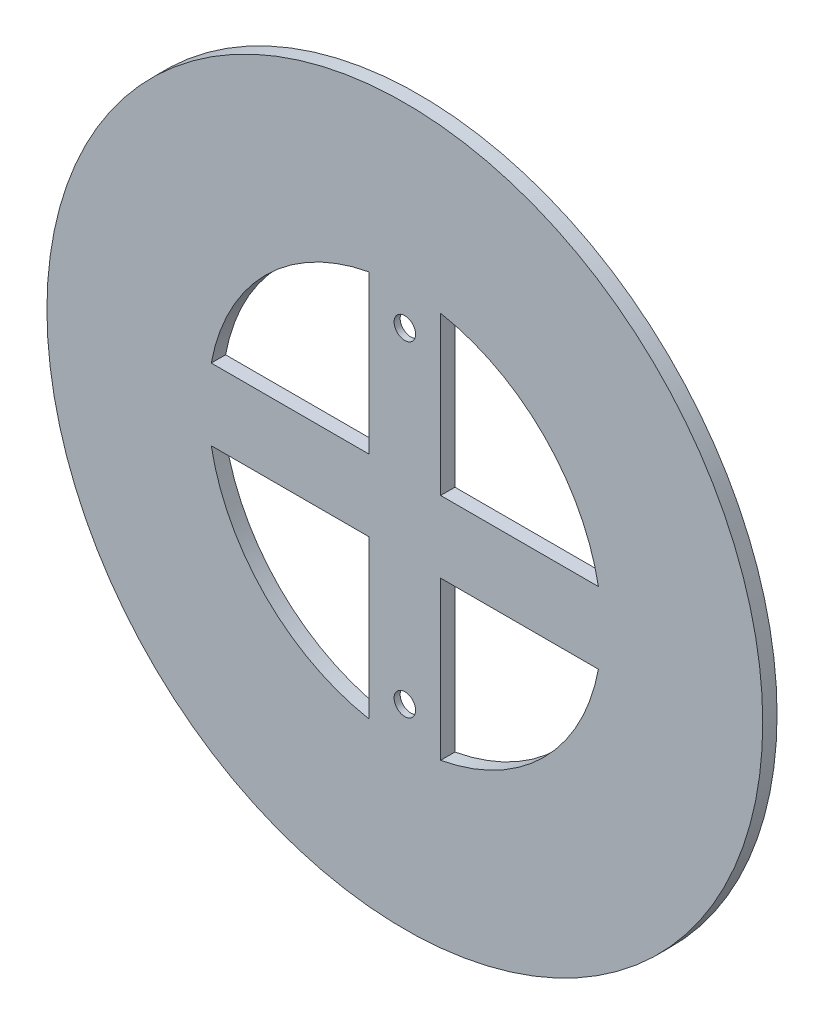
ISO-10303-21;
HEADER;
FILE_DESCRIPTION(('STEP AP214'),'2;1');
FILE_NAME('part.step','',(''),(''),'','','');
FILE_SCHEMA(('AUTOMOTIVE_DESIGN { 1 0 10303 214 1 1 1 1 }'));
ENDSEC;
DATA;
#1=APPLICATION_CONTEXT('core data for automotive mechanical design processes');
#2=APPLICATION_PROTOCOL_DEFINITION('international standard','automotive_design',2000,#1);
#3=PRODUCT_CONTEXT('',#1,'mechanical');
#4=PRODUCT('Part','Part','',(#3));
#5=PRODUCT_RELATED_PRODUCT_CATEGORY('part','',(#4));
#6=PRODUCT_DEFINITION_FORMATION('','',#4);
#7=PRODUCT_DEFINITION_CONTEXT('part definition',#1,'design');
#8=PRODUCT_DEFINITION('design','',#6,#7);
#9=PRODUCT_DEFINITION_SHAPE('','',#8);
#10=(LENGTH_UNIT() NAMED_UNIT(*) SI_UNIT(.MILLI.,.METRE.));
#11=(NAMED_UNIT(*) PLANE_ANGLE_UNIT() SI_UNIT($,.RADIAN.));
#12=(NAMED_UNIT(*) SI_UNIT($,.STERADIAN.) SOLID_ANGLE_UNIT());
#13=UNCERTAINTY_MEASURE_WITH_UNIT(LENGTH_MEASURE(1.E-05),#10,'distance_accuracy_value','');
#14=(GEOMETRIC_REPRESENTATION_CONTEXT(3) GLOBAL_UNCERTAINTY_ASSIGNED_CONTEXT((#13)) GLOBAL_UNIT_ASSIGNED_CONTEXT((#10,
#11,#12)) REPRESENTATION_CONTEXT('',''));
#15=CARTESIAN_POINT('',(0.,0.,0.));
#16=DIRECTION('',(0.,0.,1.));
#17=DIRECTION('',(1.,0.,0.));
#18=AXIS2_PLACEMENT_3D('',#15,#16,#17);
#19=CARTESIAN_POINT('',(0.,0.,0.));
#20=DIRECTION('',(0.,0.,1.));
#21=DIRECTION('',(1.,0.,0.));
#22=AXIS2_PLACEMENT_3D('',#19,#20,#21);
#23=PLANE('',#22);
#24=CARTESIAN_POINT('',(0.,0.,0.));
#25=DIRECTION('',(0.,0.,1.));
#26=DIRECTION('',(1.,0.,0.));
#27=AXIS2_PLACEMENT_3D('',#24,#25,#26);
#28=CIRCLE('',#27,50.);
#29=CARTESIAN_POINT('',(50.,0.,0.));
#30=VERTEX_POINT('',#29);
#31=EDGE_CURVE('E237',#30,#30,#28,.T.);
#32=ORIENTED_EDGE('',*,*,#31,.F.);
#33=EDGE_LOOP('',(#32));
#34=FACE_BOUND('',#33,.T.);
#35=CARTESIAN_POINT('',(0.,0.,0.));
#36=DIRECTION('',(0.,0.,1.));
#37=DIRECTION('',(1.,0.,0.));
#38=AXIS2_PLACEMENT_3D('',#35,#36,#37);
#39=CIRCLE('',#38,42.5);
#40=CARTESIAN_POINT('',(42.5,0.,0.));
#41=VERTEX_POINT('',#40);
#42=EDGE_CURVE('E231',#41,#41,#39,.T.);
#43=ORIENTED_EDGE('',*,*,#42,.T.);
#44=EDGE_LOOP('',(#43));
#45=FACE_BOUND('',#44,.T.);
#46=ADVANCED_FACE('F33',(#34,#45),#23,.F.);
#47=CARTESIAN_POINT('',(0.,0.,2.));
#48=DIRECTION('',(0.,0.,-1.));
#49=DIRECTION('',(-1.,0.,0.));
#50=AXIS2_PLACEMENT_3D('',#47,#48,#49);
#51=CYLINDRICAL_SURFACE('',#50,50.);
#52=CARTESIAN_POINT('',(0.,0.,2.));
#53=DIRECTION('',(0.,0.,1.));
#54=DIRECTION('',(1.,0.,0.));
#55=AXIS2_PLACEMENT_3D('',#52,#53,#54);
#56=CIRCLE('',#55,50.);
#57=CARTESIAN_POINT('',(50.,0.,2.));
#58=VERTEX_POINT('',#57);
#59=EDGE_CURVE('E240',#58,#58,#56,.T.);
#60=ORIENTED_EDGE('',*,*,#59,.F.);
#61=EDGE_LOOP('',(#60));
#62=FACE_BOUND('',#61,.T.);
#63=ORIENTED_EDGE('',*,*,#31,.T.);
#64=EDGE_LOOP('',(#63));
#65=FACE_BOUND('',#64,.T.);
#66=ADVANCED_FACE('F272',(#62,#65),#51,.T.);
#67=CARTESIAN_POINT('',(0.,0.,2.));
#68=DIRECTION('',(0.,0.,1.));
#69=DIRECTION('',(1.,0.,0.));
#70=AXIS2_PLACEMENT_3D('',#67,#68,#69);
#71=PLANE('',#70);
#72=CARTESIAN_POINT('',(0.,0.,2.));
#73=DIRECTION('',(0.,0.,-1.));
#74=DIRECTION('',(-1.,0.,0.));
#75=AXIS2_PLACEMENT_3D('',#72,#73,#74);
#76=CIRCLE('',#75,27.5);
#77=CARTESIAN_POINT('',(27.0416345659799,-5.00000000000001,2.));
#78=VERTEX_POINT('',#77);
#79=CARTESIAN_POINT('',(4.99999999999999,-27.0416345659799,2.));
#80=VERTEX_POINT('',#79);
#81=EDGE_CURVE('E124',#78,#80,#76,.T.);
#82=ORIENTED_EDGE('',*,*,#81,.T.);
#83=DIRECTION('',(0.,1.,0.));
#84=VECTOR('',#83,1.);
#85=CARTESIAN_POINT('',(4.99999999999999,-27.0416345659799,2.));
#86=LINE('',#85,#84);
#87=CARTESIAN_POINT('',(4.99999999999999,-5.00000000000001,2.));
#88=VERTEX_POINT('',#87);
#89=EDGE_CURVE('E131',#80,#88,#86,.T.);
#90=ORIENTED_EDGE('',*,*,#89,.T.);
#91=DIRECTION('',(1.,0.,0.));
#92=VECTOR('',#91,1.);
#93=CARTESIAN_POINT('',(27.0416345659799,-5.00000000000001,2.));
#94=LINE('',#93,#92);
#95=EDGE_CURVE('E48',#88,#78,#94,.T.);
#96=ORIENTED_EDGE('',*,*,#95,.T.);
#97=EDGE_LOOP('',(#82,#90,#96));
#98=FACE_BOUND('',#97,.T.);
#99=CARTESIAN_POINT('',(0.,0.,2.));
#100=DIRECTION('',(0.,0.,-1.));
#101=DIRECTION('',(-1.,0.,0.));
#102=AXIS2_PLACEMENT_3D('',#99,#100,#101);
#103=CIRCLE('',#102,27.5);
#104=CARTESIAN_POINT('',(-5.00000000000001,-27.0416345659799,2.));
#105=VERTEX_POINT('',#104);
#106=CARTESIAN_POINT('',(-27.0416345659799,-5.,2.));
#107=VERTEX_POINT('',#106);
#108=EDGE_CURVE('E150',#105,#107,#103,.T.);
#109=ORIENTED_EDGE('',*,*,#108,.T.);
#110=DIRECTION('',(1.,0.,0.));
#111=VECTOR('',#110,1.);
#112=CARTESIAN_POINT('',(-27.0416345659799,-5.,2.));
#113=LINE('',#112,#111);
#114=CARTESIAN_POINT('',(-5.00000000000001,-5.,2.));
#115=VERTEX_POINT('',#114);
#116=EDGE_CURVE('E153',#107,#115,#113,.T.);
#117=ORIENTED_EDGE('',*,*,#116,.T.);
#118=DIRECTION('',(0.,-1.,0.));
#119=VECTOR('',#118,1.);
#120=CARTESIAN_POINT('',(-5.00000000000001,-27.0416345659799,2.));
#121=LINE('',#120,#119);
#122=EDGE_CURVE('E157',#115,#105,#121,.T.);
#123=ORIENTED_EDGE('',*,*,#122,.T.);
#124=EDGE_LOOP('',(#109,#117,#123));
#125=FACE_BOUND('',#124,.T.);
#126=CARTESIAN_POINT('',(0.,-22.75,2.));
#127=DIRECTION('',(0.,0.,-1.));
#128=DIRECTION('',(1.,0.,0.));
#129=AXIS2_PLACEMENT_3D('',#126,#127,#128);
#130=CIRCLE('',#129,1.5);
#131=CARTESIAN_POINT('',(1.5,-22.75,2.));
#132=VERTEX_POINT('',#131);
#133=EDGE_CURVE('E169',#132,#132,#130,.T.);
#134=ORIENTED_EDGE('',*,*,#133,.T.);
#135=EDGE_LOOP('',(#134));
#136=FACE_BOUND('',#135,.T.);
#137=CARTESIAN_POINT('',(0.,0.,2.));
#138=DIRECTION('',(0.,0.,-1.));
#139=DIRECTION('',(-1.,0.,0.));
#140=AXIS2_PLACEMENT_3D('',#137,#138,#139);
#141=CIRCLE('',#140,27.5);
#142=CARTESIAN_POINT('',(-27.0416345659799,5.,2.));
#143=VERTEX_POINT('',#142);
#144=CARTESIAN_POINT('',(-5.,27.0416345659799,2.));
#145=VERTEX_POINT('',#144);
#146=EDGE_CURVE('E177',#143,#145,#141,.T.);
#147=ORIENTED_EDGE('',*,*,#146,.T.);
#148=DIRECTION('',(0.,-1.,0.));
#149=VECTOR('',#148,1.);
#150=CARTESIAN_POINT('',(-5.,27.0416345659799,2.));
#151=LINE('',#150,#149);
#152=CARTESIAN_POINT('',(-5.,5.,2.));
#153=VERTEX_POINT('',#152);
#154=EDGE_CURVE('E180',#145,#153,#151,.T.);
#155=ORIENTED_EDGE('',*,*,#154,.T.);
#156=DIRECTION('',(-1.,0.,0.));
#157=VECTOR('',#156,1.);
#158=CARTESIAN_POINT('',(-27.0416345659799,5.,2.));
#159=LINE('',#158,#157);
#160=EDGE_CURVE('E184',#153,#143,#159,.T.);
#161=ORIENTED_EDGE('',*,*,#160,.T.);
#162=EDGE_LOOP('',(#147,#155,#161));
#163=FACE_BOUND('',#162,.T.);
#164=CARTESIAN_POINT('',(0.,22.75,2.));
#165=DIRECTION('',(0.,0.,-1.));
#166=DIRECTION('',(-1.,0.,0.));
#167=AXIS2_PLACEMENT_3D('',#164,#165,#166);
#168=CIRCLE('',#167,1.5);
#169=CARTESIAN_POINT('',(-1.5,22.75,2.));
#170=VERTEX_POINT('',#169);
#171=EDGE_CURVE('E196',#170,#170,#168,.T.);
#172=ORIENTED_EDGE('',*,*,#171,.T.);
#173=EDGE_LOOP('',(#172));
#174=FACE_BOUND('',#173,.T.);
#175=CARTESIAN_POINT('',(0.,0.,2.));
#176=DIRECTION('',(0.,0.,-1.));
#177=DIRECTION('',(-1.,0.,0.));
#178=AXIS2_PLACEMENT_3D('',#175,#176,#177);
#179=CIRCLE('',#178,27.5);
#180=CARTESIAN_POINT('',(5.,27.0416345659799,2.));
#181=VERTEX_POINT('',#180);
#182=CARTESIAN_POINT('',(27.0416345659799,4.99999999999999,2.));
#183=VERTEX_POINT('',#182);
#184=EDGE_CURVE('E204',#181,#183,#179,.T.);
#185=ORIENTED_EDGE('',*,*,#184,.T.);
#186=DIRECTION('',(-1.,0.,0.));
#187=VECTOR('',#186,1.);
#188=CARTESIAN_POINT('',(27.0416345659799,4.99999999999999,2.));
#189=LINE('',#188,#187);
#190=CARTESIAN_POINT('',(5.,4.99999999999999,2.));
#191=VERTEX_POINT('',#190);
#192=EDGE_CURVE('E207',#183,#191,#189,.T.);
#193=ORIENTED_EDGE('',*,*,#192,.T.);
#194=DIRECTION('',(0.,1.,0.));
#195=VECTOR('',#194,1.);
#196=CARTESIAN_POINT('',(5.,27.0416345659799,2.));
#197=LINE('',#196,#195);
#198=EDGE_CURVE('E211',#191,#181,#197,.T.);
#199=ORIENTED_EDGE('',*,*,#198,.T.);
#200=EDGE_LOOP('',(#185,#193,#199));
#201=FACE_BOUND('',#200,.T.);
#202=ORIENTED_EDGE('',*,*,#59,.T.);
#203=EDGE_LOOP('',(#202));
#204=FACE_BOUND('',#203,.T.);
#205=ADVANCED_FACE('F135',(#98,#125,#136,#163,#174,#201,#204),#71,.T.);
#206=CARTESIAN_POINT('',(0.,0.,1.));
#207=DIRECTION('',(0.,0.,1.));
#208=DIRECTION('',(1.,0.,0.));
#209=AXIS2_PLACEMENT_3D('',#206,#207,#208);
#210=PLANE('',#209);
#211=CARTESIAN_POINT('',(0.,0.,1.));
#212=DIRECTION('',(0.,0.,1.));
#213=DIRECTION('',(1.,0.,0.));
#214=AXIS2_PLACEMENT_3D('',#211,#212,#213);
#215=CIRCLE('',#214,42.5);
#216=CARTESIAN_POINT('',(42.5,0.,1.));
#217=VERTEX_POINT('',#216);
#218=EDGE_CURVE('E234',#217,#217,#215,.T.);
#219=ORIENTED_EDGE('',*,*,#218,.F.);
#220=EDGE_LOOP('',(#219));
#221=FACE_BOUND('',#220,.T.);
#222=CARTESIAN_POINT('',(0.,0.,1.));
#223=DIRECTION('',(0.,0.,1.));
#224=DIRECTION('',(1.,0.,0.));
#225=AXIS2_PLACEMENT_3D('',#222,#223,#224);
#226=CIRCLE('',#225,36.25);
#227=CARTESIAN_POINT('',(36.25,0.,1.));
#228=VERTEX_POINT('',#227);
#229=EDGE_CURVE('E228',#228,#228,#226,.T.);
#230=ORIENTED_EDGE('',*,*,#229,.T.);
#231=EDGE_LOOP('',(#230));
#232=FACE_BOUND('',#231,.T.);
#233=ADVANCED_FACE('F271',(#221,#232),#210,.F.);
#234=CARTESIAN_POINT('',(0.,0.,1.));
#235=DIRECTION('',(0.,0.,-1.));
#236=DIRECTION('',(-1.,0.,0.));
#237=AXIS2_PLACEMENT_3D('',#234,#235,#236);
#238=CYLINDRICAL_SURFACE('',#237,42.5);
#239=ORIENTED_EDGE('',*,*,#218,.T.);
#240=EDGE_LOOP('',(#239));
#241=FACE_BOUND('',#240,.T.);
#242=ORIENTED_EDGE('',*,*,#42,.F.);
#243=EDGE_LOOP('',(#242));
#244=FACE_BOUND('',#243,.T.);
#245=ADVANCED_FACE('F292',(#241,#244),#238,.F.);
#246=CARTESIAN_POINT('',(0.,0.,1.));
#247=DIRECTION('',(0.,0.,-1.));
#248=DIRECTION('',(-1.,0.,0.));
#249=AXIS2_PLACEMENT_3D('',#246,#247,#248);
#250=CYLINDRICAL_SURFACE('',#249,36.25);
#251=ORIENTED_EDGE('',*,*,#229,.F.);
#252=EDGE_LOOP('',(#251));
#253=FACE_BOUND('',#252,.T.);
#254=CARTESIAN_POINT('',(0.,0.,0.));
#255=DIRECTION('',(0.,0.,1.));
#256=DIRECTION('',(1.,0.,0.));
#257=AXIS2_PLACEMENT_3D('',#254,#255,#256);
#258=CIRCLE('',#257,36.25);
#259=CARTESIAN_POINT('',(36.25,0.,0.));
#260=VERTEX_POINT('',#259);
#261=EDGE_CURVE('E223',#260,#260,#258,.T.);
#262=ORIENTED_EDGE('',*,*,#261,.T.);
#263=EDGE_LOOP('',(#262));
#264=FACE_BOUND('',#263,.T.);
#265=ADVANCED_FACE('F294',(#253,#264),#250,.T.);
#266=CARTESIAN_POINT('',(0.,-22.75,0.));
#267=DIRECTION('',(0.,0.,1.));
#268=DIRECTION('',(1.,0.,0.));
#269=AXIS2_PLACEMENT_3D('',#266,#267,#268);
#270=CIRCLE('',#269,3.50000000000003);
#271=CARTESIAN_POINT('',(3.50000000000003,-22.75,0.));
#272=VERTEX_POINT('',#271);
#273=EDGE_CURVE('E41',#272,#272,#270,.T.);
#274=ORIENTED_EDGE('',*,*,#273,.T.);
#275=EDGE_LOOP('',(#274));
#276=FACE_BOUND('',#275,.T.);
#277=CARTESIAN_POINT('',(0.,22.75,0.));
#278=DIRECTION('',(0.,0.,1.));
#279=DIRECTION('',(1.,0.,0.));
#280=AXIS2_PLACEMENT_3D('',#277,#278,#279);
#281=CIRCLE('',#280,3.50000000000003);
#282=CARTESIAN_POINT('',(3.50000000000003,22.75,0.));
#283=VERTEX_POINT('',#282);
#284=EDGE_CURVE('E248',#283,#283,#281,.T.);
#285=ORIENTED_EDGE('',*,*,#284,.T.);
#286=EDGE_LOOP('',(#285));
#287=FACE_BOUND('',#286,.T.);
#288=DIRECTION('',(0.,1.,0.));
#289=VECTOR('',#288,1.);
#290=CARTESIAN_POINT('',(4.99999999999999,-27.0416345659799,0.));
#291=LINE('',#290,#289);
#292=CARTESIAN_POINT('',(4.99999999999999,-27.0416345659799,0.));
#293=VERTEX_POINT('',#292);
#294=CARTESIAN_POINT('',(4.99999999999999,-5.00000000000001,0.));
#295=VERTEX_POINT('',#294);
#296=EDGE_CURVE('E140',#293,#295,#291,.T.);
#297=ORIENTED_EDGE('',*,*,#296,.F.);
#298=CARTESIAN_POINT('',(0.,0.,0.));
#299=DIRECTION('',(0.,0.,-1.));
#300=DIRECTION('',(-1.,0.,0.));
#301=AXIS2_PLACEMENT_3D('',#298,#299,#300);
#302=CIRCLE('',#301,27.5);
#303=CARTESIAN_POINT('',(27.0416345659799,-5.00000000000001,0.));
#304=VERTEX_POINT('',#303);
#305=EDGE_CURVE('E56',#304,#293,#302,.T.);
#306=ORIENTED_EDGE('',*,*,#305,.F.);
#307=DIRECTION('',(1.,0.,0.));
#308=VECTOR('',#307,1.);
#309=CARTESIAN_POINT('',(27.0416345659799,-5.00000000000001,0.));
#310=LINE('',#309,#308);
#311=EDGE_CURVE('E137',#295,#304,#310,.T.);
#312=ORIENTED_EDGE('',*,*,#311,.F.);
#313=EDGE_LOOP('',(#297,#306,#312));
#314=FACE_BOUND('',#313,.T.);
#315=DIRECTION('',(1.,0.,0.));
#316=VECTOR('',#315,1.);
#317=CARTESIAN_POINT('',(-27.0416345659799,-5.,0.));
#318=LINE('',#317,#316);
#319=CARTESIAN_POINT('',(-27.0416345659799,-5.,0.));
#320=VERTEX_POINT('',#319);
#321=CARTESIAN_POINT('',(-5.00000000000001,-5.,0.));
#322=VERTEX_POINT('',#321);
#323=EDGE_CURVE('E162',#320,#322,#318,.T.);
#324=ORIENTED_EDGE('',*,*,#323,.F.);
#325=CARTESIAN_POINT('',(0.,0.,0.));
#326=DIRECTION('',(0.,0.,-1.));
#327=DIRECTION('',(-1.,0.,0.));
#328=AXIS2_PLACEMENT_3D('',#325,#326,#327);
#329=CIRCLE('',#328,27.5);
#330=CARTESIAN_POINT('',(-5.00000000000001,-27.0416345659799,0.));
#331=VERTEX_POINT('',#330);
#332=EDGE_CURVE('E148',#331,#320,#329,.T.);
#333=ORIENTED_EDGE('',*,*,#332,.F.);
#334=DIRECTION('',(0.,-1.,0.));
#335=VECTOR('',#334,1.);
#336=CARTESIAN_POINT('',(-5.00000000000001,-27.0416345659799,0.));
#337=LINE('',#336,#335);
#338=EDGE_CURVE('E154',#322,#331,#337,.T.);
#339=ORIENTED_EDGE('',*,*,#338,.F.);
#340=EDGE_LOOP('',(#324,#333,#339));
#341=FACE_BOUND('',#340,.T.);
#342=DIRECTION('',(0.,-1.,0.));
#343=VECTOR('',#342,1.);
#344=CARTESIAN_POINT('',(-5.,27.0416345659799,0.));
#345=LINE('',#344,#343);
#346=CARTESIAN_POINT('',(-5.,27.0416345659799,0.));
#347=VERTEX_POINT('',#346);
#348=CARTESIAN_POINT('',(-5.,5.,0.));
#349=VERTEX_POINT('',#348);
#350=EDGE_CURVE('E189',#347,#349,#345,.T.);
#351=ORIENTED_EDGE('',*,*,#350,.F.);
#352=CARTESIAN_POINT('',(0.,0.,0.));
#353=DIRECTION('',(0.,0.,-1.));
#354=DIRECTION('',(-1.,0.,0.));
#355=AXIS2_PLACEMENT_3D('',#352,#353,#354);
#356=CIRCLE('',#355,27.5);
#357=CARTESIAN_POINT('',(-27.0416345659799,5.,0.));
#358=VERTEX_POINT('',#357);
#359=EDGE_CURVE('E176',#358,#347,#356,.T.);
#360=ORIENTED_EDGE('',*,*,#359,.F.);
#361=DIRECTION('',(-1.,0.,0.));
#362=VECTOR('',#361,1.);
#363=CARTESIAN_POINT('',(-27.0416345659799,5.,0.));
#364=LINE('',#363,#362);
#365=EDGE_CURVE('E181',#349,#358,#364,.T.);
#366=ORIENTED_EDGE('',*,*,#365,.F.);
#367=EDGE_LOOP('',(#351,#360,#366));
#368=FACE_BOUND('',#367,.T.);
#369=DIRECTION('',(-1.,0.,0.));
#370=VECTOR('',#369,1.);
#371=CARTESIAN_POINT('',(27.0416345659799,4.99999999999999,0.));
#372=LINE('',#371,#370);
#373=CARTESIAN_POINT('',(27.0416345659799,4.99999999999999,0.));
#374=VERTEX_POINT('',#373);
#375=CARTESIAN_POINT('',(5.,4.99999999999999,0.));
#376=VERTEX_POINT('',#375);
#377=EDGE_CURVE('E216',#374,#376,#372,.T.);
#378=ORIENTED_EDGE('',*,*,#377,.F.);
#379=CARTESIAN_POINT('',(0.,0.,0.));
#380=DIRECTION('',(0.,0.,-1.));
#381=DIRECTION('',(-1.,0.,0.));
#382=AXIS2_PLACEMENT_3D('',#379,#380,#381);
#383=CIRCLE('',#382,27.5);
#384=CARTESIAN_POINT('',(5.,27.0416345659799,0.));
#385=VERTEX_POINT('',#384);
#386=EDGE_CURVE('E203',#385,#374,#383,.T.);
#387=ORIENTED_EDGE('',*,*,#386,.F.);
#388=DIRECTION('',(0.,1.,0.));
#389=VECTOR('',#388,1.);
#390=CARTESIAN_POINT('',(5.,27.0416345659799,0.));
#391=LINE('',#390,#389);
#392=EDGE_CURVE('E208',#376,#385,#391,.T.);
#393=ORIENTED_EDGE('',*,*,#392,.F.);
#394=EDGE_LOOP('',(#378,#387,#393));
#395=FACE_BOUND('',#394,.T.);
#396=ORIENTED_EDGE('',*,*,#261,.F.);
#397=EDGE_LOOP('',(#396));
#398=FACE_BOUND('',#397,.T.);
#399=ADVANCED_FACE('F253',(#276,#287,#314,#341,#368,#395,#398),#23,.F.);
#400=CARTESIAN_POINT('',(0.,0.,2.));
#401=DIRECTION('',(0.,0.,-1.));
#402=DIRECTION('',(-1.,0.,0.));
#403=AXIS2_PLACEMENT_3D('',#400,#401,#402);
#404=CYLINDRICAL_SURFACE('',#403,27.5);
#405=ORIENTED_EDGE('',*,*,#386,.T.);
#406=DIRECTION('',(0.,0.,-1.));
#407=VECTOR('',#406,1.);
#408=CARTESIAN_POINT('',(27.0416345659799,4.99999999999999,2.));
#409=LINE('',#408,#407);
#410=EDGE_CURVE('E214',#183,#374,#409,.T.);
#411=ORIENTED_EDGE('',*,*,#410,.F.);
#412=ORIENTED_EDGE('',*,*,#184,.F.);
#413=DIRECTION('',(0.,0.,-1.));
#414=VECTOR('',#413,1.);
#415=CARTESIAN_POINT('',(5.,27.0416345659799,2.));
#416=LINE('',#415,#414);
#417=EDGE_CURVE('E221',#181,#385,#416,.T.);
#418=ORIENTED_EDGE('',*,*,#417,.T.);
#419=EDGE_LOOP('',(#405,#411,#412,#418));
#420=FACE_BOUND('',#419,.T.);
#421=ADVANCED_FACE('F306',(#420),#404,.F.);
#422=CARTESIAN_POINT('',(5.,27.0416345659799,2.));
#423=DIRECTION('',(-1.,0.,0.));
#424=DIRECTION('',(0.,-1.,0.));
#425=AXIS2_PLACEMENT_3D('',#422,#423,#424);
#426=PLANE('',#425);
#427=ORIENTED_EDGE('',*,*,#392,.T.);
#428=ORIENTED_EDGE('',*,*,#417,.F.);
#429=ORIENTED_EDGE('',*,*,#198,.F.);
#430=DIRECTION('',(0.,0.,-1.));
#431=VECTOR('',#430,1.);
#432=CARTESIAN_POINT('',(5.,4.99999999999999,2.));
#433=LINE('',#432,#431);
#434=EDGE_CURVE('E224',#191,#376,#433,.T.);
#435=ORIENTED_EDGE('',*,*,#434,.T.);
#436=EDGE_LOOP('',(#427,#428,#429,#435));
#437=FACE_BOUND('',#436,.T.);
#438=ADVANCED_FACE('F310',(#437),#426,.F.);
#439=CARTESIAN_POINT('',(27.0416345659799,4.99999999999999,2.));
#440=DIRECTION('',(0.,-1.,0.));
#441=DIRECTION('',(1.,0.,0.));
#442=AXIS2_PLACEMENT_3D('',#439,#440,#441);
#443=PLANE('',#442);
#444=ORIENTED_EDGE('',*,*,#377,.T.);
#445=ORIENTED_EDGE('',*,*,#434,.F.);
#446=ORIENTED_EDGE('',*,*,#192,.F.);
#447=ORIENTED_EDGE('',*,*,#410,.T.);
#448=EDGE_LOOP('',(#444,#445,#446,#447));
#449=FACE_BOUND('',#448,.T.);
#450=ADVANCED_FACE('F316',(#449),#443,.F.);
#451=CARTESIAN_POINT('',(0.,22.75,2.));
#452=DIRECTION('',(0.,0.,-1.));
#453=DIRECTION('',(-1.,0.,0.));
#454=AXIS2_PLACEMENT_3D('',#451,#452,#453);
#455=CYLINDRICAL_SURFACE('',#454,1.5);
#456=CARTESIAN_POINT('',(0.,22.75,1.15470053837925));
#457=DIRECTION('',(0.,0.,1.));
#458=DIRECTION('',(1.,0.,0.));
#459=AXIS2_PLACEMENT_3D('',#456,#457,#458);
#460=CIRCLE('',#459,1.5);
#461=CARTESIAN_POINT('',(1.5,22.75,1.15470053837925));
#462=VERTEX_POINT('',#461);
#463=EDGE_CURVE('E11',#462,#462,#460,.F.);
#464=ORIENTED_EDGE('',*,*,#463,.T.);
#465=EDGE_LOOP('',(#464));
#466=FACE_BOUND('',#465,.T.);
#467=ORIENTED_EDGE('',*,*,#171,.F.);
#468=EDGE_LOOP('',(#467));
#469=FACE_BOUND('',#468,.T.);
#470=ADVANCED_FACE('F321',(#466,#469),#455,.F.);
#471=CARTESIAN_POINT('',(0.,0.,2.));
#472=DIRECTION('',(0.,0.,-1.));
#473=DIRECTION('',(-1.,0.,0.));
#474=AXIS2_PLACEMENT_3D('',#471,#472,#473);
#475=CYLINDRICAL_SURFACE('',#474,27.5);
#476=ORIENTED_EDGE('',*,*,#359,.T.);
#477=DIRECTION('',(0.,0.,-1.));
#478=VECTOR('',#477,1.);
#479=CARTESIAN_POINT('',(-5.,27.0416345659799,2.));
#480=LINE('',#479,#478);
#481=EDGE_CURVE('E187',#145,#347,#480,.T.);
#482=ORIENTED_EDGE('',*,*,#481,.F.);
#483=ORIENTED_EDGE('',*,*,#146,.F.);
#484=DIRECTION('',(0.,0.,-1.));
#485=VECTOR('',#484,1.);
#486=CARTESIAN_POINT('',(-27.0416345659799,5.,2.));
#487=LINE('',#486,#485);
#488=EDGE_CURVE('E194',#143,#358,#487,.T.);
#489=ORIENTED_EDGE('',*,*,#488,.T.);
#490=EDGE_LOOP('',(#476,#482,#483,#489));
#491=FACE_BOUND('',#490,.T.);
#492=ADVANCED_FACE('F326',(#491),#475,.F.);
#493=CARTESIAN_POINT('',(-27.0416345659799,5.,2.));
#494=DIRECTION('',(0.,-1.,0.));
#495=DIRECTION('',(1.,0.,0.));
#496=AXIS2_PLACEMENT_3D('',#493,#494,#495);
#497=PLANE('',#496);
#498=ORIENTED_EDGE('',*,*,#365,.T.);
#499=ORIENTED_EDGE('',*,*,#488,.F.);
#500=ORIENTED_EDGE('',*,*,#160,.F.);
#501=DIRECTION('',(0.,0.,-1.));
#502=VECTOR('',#501,1.);
#503=CARTESIAN_POINT('',(-5.,5.,2.));
#504=LINE('',#503,#502);
#505=EDGE_CURVE('E197',#153,#349,#504,.T.);
#506=ORIENTED_EDGE('',*,*,#505,.T.);
#507=EDGE_LOOP('',(#498,#499,#500,#506));
#508=FACE_BOUND('',#507,.T.);
#509=ADVANCED_FACE('F330',(#508),#497,.F.);
#510=CARTESIAN_POINT('',(-5.,27.0416345659799,2.));
#511=DIRECTION('',(1.,0.,0.));
#512=DIRECTION('',(0.,1.,0.));
#513=AXIS2_PLACEMENT_3D('',#510,#511,#512);
#514=PLANE('',#513);
#515=ORIENTED_EDGE('',*,*,#350,.T.);
#516=ORIENTED_EDGE('',*,*,#505,.F.);
#517=ORIENTED_EDGE('',*,*,#154,.F.);
#518=ORIENTED_EDGE('',*,*,#481,.T.);
#519=EDGE_LOOP('',(#515,#516,#517,#518));
#520=FACE_BOUND('',#519,.T.);
#521=ADVANCED_FACE('F265',(#520),#514,.F.);
#522=CARTESIAN_POINT('',(0.,-22.75,2.));
#523=DIRECTION('',(0.,0.,-1.));
#524=DIRECTION('',(-1.,0.,0.));
#525=AXIS2_PLACEMENT_3D('',#522,#523,#524);
#526=CYLINDRICAL_SURFACE('',#525,1.5);
#527=CARTESIAN_POINT('',(0.,-22.75,1.15470053837925));
#528=DIRECTION('',(0.,0.,1.));
#529=DIRECTION('',(1.,0.,0.));
#530=AXIS2_PLACEMENT_3D('',#527,#528,#529);
#531=CIRCLE('',#530,1.5);
#532=CARTESIAN_POINT('',(1.5,-22.75,1.15470053837925));
#533=VERTEX_POINT('',#532);
#534=EDGE_CURVE('E243',#533,#533,#531,.F.);
#535=ORIENTED_EDGE('',*,*,#534,.T.);
#536=EDGE_LOOP('',(#535));
#537=FACE_BOUND('',#536,.T.);
#538=ORIENTED_EDGE('',*,*,#133,.F.);
#539=EDGE_LOOP('',(#538));
#540=FACE_BOUND('',#539,.T.);
#541=ADVANCED_FACE('F261',(#537,#540),#526,.F.);
#542=CARTESIAN_POINT('',(0.,0.,2.));
#543=DIRECTION('',(0.,0.,-1.));
#544=DIRECTION('',(-1.,0.,0.));
#545=AXIS2_PLACEMENT_3D('',#542,#543,#544);
#546=CYLINDRICAL_SURFACE('',#545,27.5);
#547=ORIENTED_EDGE('',*,*,#332,.T.);
#548=DIRECTION('',(0.,0.,-1.));
#549=VECTOR('',#548,1.);
#550=CARTESIAN_POINT('',(-27.0416345659799,-5.,2.));
#551=LINE('',#550,#549);
#552=EDGE_CURVE('E160',#107,#320,#551,.T.);
#553=ORIENTED_EDGE('',*,*,#552,.F.);
#554=ORIENTED_EDGE('',*,*,#108,.F.);
#555=DIRECTION('',(0.,0.,-1.));
#556=VECTOR('',#555,1.);
#557=CARTESIAN_POINT('',(-5.00000000000001,-27.0416345659799,2.));
#558=LINE('',#557,#556);
#559=EDGE_CURVE('E167',#105,#331,#558,.T.);
#560=ORIENTED_EDGE('',*,*,#559,.T.);
#561=EDGE_LOOP('',(#547,#553,#554,#560));
#562=FACE_BOUND('',#561,.T.);
#563=ADVANCED_FACE('F264',(#562),#546,.F.);
#564=CARTESIAN_POINT('',(-5.00000000000001,-27.0416345659799,2.));
#565=DIRECTION('',(1.,0.,0.));
#566=DIRECTION('',(0.,1.,0.));
#567=AXIS2_PLACEMENT_3D('',#564,#565,#566);
#568=PLANE('',#567);
#569=ORIENTED_EDGE('',*,*,#338,.T.);
#570=ORIENTED_EDGE('',*,*,#559,.F.);
#571=ORIENTED_EDGE('',*,*,#122,.F.);
#572=DIRECTION('',(0.,0.,-1.));
#573=VECTOR('',#572,1.);
#574=CARTESIAN_POINT('',(-5.00000000000001,-5.,2.));
#575=LINE('',#574,#573);
#576=EDGE_CURVE('E170',#115,#322,#575,.T.);
#577=ORIENTED_EDGE('',*,*,#576,.T.);
#578=EDGE_LOOP('',(#569,#570,#571,#577));
#579=FACE_BOUND('',#578,.T.);
#580=ADVANCED_FACE('F340',(#579),#568,.F.);
#581=CARTESIAN_POINT('',(-27.0416345659799,-5.,2.));
#582=DIRECTION('',(0.,1.,0.));
#583=DIRECTION('',(-1.,0.,0.));
#584=AXIS2_PLACEMENT_3D('',#581,#582,#583);
#585=PLANE('',#584);
#586=ORIENTED_EDGE('',*,*,#323,.T.);
#587=ORIENTED_EDGE('',*,*,#576,.F.);
#588=ORIENTED_EDGE('',*,*,#116,.F.);
#589=ORIENTED_EDGE('',*,*,#552,.T.);
#590=EDGE_LOOP('',(#586,#587,#588,#589));
#591=FACE_BOUND('',#590,.T.);
#592=ADVANCED_FACE('F342',(#591),#585,.F.);
#593=CARTESIAN_POINT('',(0.,0.,2.));
#594=DIRECTION('',(0.,0.,-1.));
#595=DIRECTION('',(-1.,0.,0.));
#596=AXIS2_PLACEMENT_3D('',#593,#594,#595);
#597=CYLINDRICAL_SURFACE('',#596,27.5);
#598=ORIENTED_EDGE('',*,*,#305,.T.);
#599=DIRECTION('',(0.,0.,-1.));
#600=VECTOR('',#599,1.);
#601=CARTESIAN_POINT('',(4.99999999999999,-27.0416345659799,2.));
#602=LINE('',#601,#600);
#603=EDGE_CURVE('E120',#80,#293,#602,.T.);
#604=ORIENTED_EDGE('',*,*,#603,.F.);
#605=ORIENTED_EDGE('',*,*,#81,.F.);
#606=DIRECTION('',(0.,0.,-1.));
#607=VECTOR('',#606,1.);
#608=CARTESIAN_POINT('',(27.0416345659799,-5.00000000000001,2.));
#609=LINE('',#608,#607);
#610=EDGE_CURVE('E146',#78,#304,#609,.T.);
#611=ORIENTED_EDGE('',*,*,#610,.T.);
#612=EDGE_LOOP('',(#598,#604,#605,#611));
#613=FACE_BOUND('',#612,.T.);
#614=ADVANCED_FACE('F122',(#613),#597,.F.);
#615=CARTESIAN_POINT('',(27.0416345659799,-5.00000000000001,2.));
#616=DIRECTION('',(0.,1.,0.));
#617=DIRECTION('',(-1.,0.,0.));
#618=AXIS2_PLACEMENT_3D('',#615,#616,#617);
#619=PLANE('',#618);
#620=ORIENTED_EDGE('',*,*,#311,.T.);
#621=ORIENTED_EDGE('',*,*,#610,.F.);
#622=ORIENTED_EDGE('',*,*,#95,.F.);
#623=DIRECTION('',(0.,0.,-1.));
#624=VECTOR('',#623,1.);
#625=CARTESIAN_POINT('',(4.99999999999999,-5.00000000000001,2.));
#626=LINE('',#625,#624);
#627=EDGE_CURVE('E128',#88,#295,#626,.T.);
#628=ORIENTED_EDGE('',*,*,#627,.T.);
#629=EDGE_LOOP('',(#620,#621,#622,#628));
#630=FACE_BOUND('',#629,.T.);
#631=ADVANCED_FACE('F351',(#630),#619,.F.);
#632=CARTESIAN_POINT('',(4.99999999999999,-27.0416345659799,2.));
#633=DIRECTION('',(-1.,0.,0.));
#634=DIRECTION('',(0.,-1.,0.));
#635=AXIS2_PLACEMENT_3D('',#632,#633,#634);
#636=PLANE('',#635);
#637=ORIENTED_EDGE('',*,*,#296,.T.);
#638=ORIENTED_EDGE('',*,*,#627,.F.);
#639=ORIENTED_EDGE('',*,*,#89,.F.);
#640=ORIENTED_EDGE('',*,*,#603,.T.);
#641=EDGE_LOOP('',(#637,#638,#639,#640));
#642=FACE_BOUND('',#641,.T.);
#643=ADVANCED_FACE('F132',(#642),#636,.F.);
#644=CARTESIAN_POINT('',(0.,-22.75,1.15470053837925));
#645=DIRECTION('',(0.,0.,-1.));
#646=DIRECTION('',(-1.,0.,0.));
#647=AXIS2_PLACEMENT_3D('',#644,#645,#646);
#648=CONICAL_SURFACE('',#647,1.5,1.04719755119661);
#649=ORIENTED_EDGE('',*,*,#273,.F.);
#650=EDGE_LOOP('',(#649));
#651=FACE_BOUND('',#650,.T.);
#652=ORIENTED_EDGE('',*,*,#534,.F.);
#653=EDGE_LOOP('',(#652));
#654=FACE_BOUND('',#653,.T.);
#655=ADVANCED_FACE('F256',(#651,#654),#648,.F.);
#656=CARTESIAN_POINT('',(0.,22.75,1.15470053837925));
#657=DIRECTION('',(0.,0.,-1.));
#658=DIRECTION('',(-1.,0.,0.));
#659=AXIS2_PLACEMENT_3D('',#656,#657,#658);
#660=CONICAL_SURFACE('',#659,1.5,1.04719755119661);
#661=ORIENTED_EDGE('',*,*,#284,.F.);
#662=EDGE_LOOP('',(#661));
#663=FACE_BOUND('',#662,.T.);
#664=ORIENTED_EDGE('',*,*,#463,.F.);
#665=EDGE_LOOP('',(#664));
#666=FACE_BOUND('',#665,.T.);
#667=ADVANCED_FACE('F35',(#663,#666),#660,.F.);
#668=CLOSED_SHELL('',(#46,#66,#205,#233,#245,#265,#399,#421,#438,#450,#470,#492,#509,#521,#541,
#563,#580,#592,#614,#631,#643,#655,#667));
#669=MANIFOLD_SOLID_BREP('B2',#668);
#670=ADVANCED_BREP_SHAPE_REPRESENTATION('',(#18,#669),#14);
#671=SHAPE_DEFINITION_REPRESENTATION(#9,#670);
ENDSEC;
END-ISO-10303-21;
